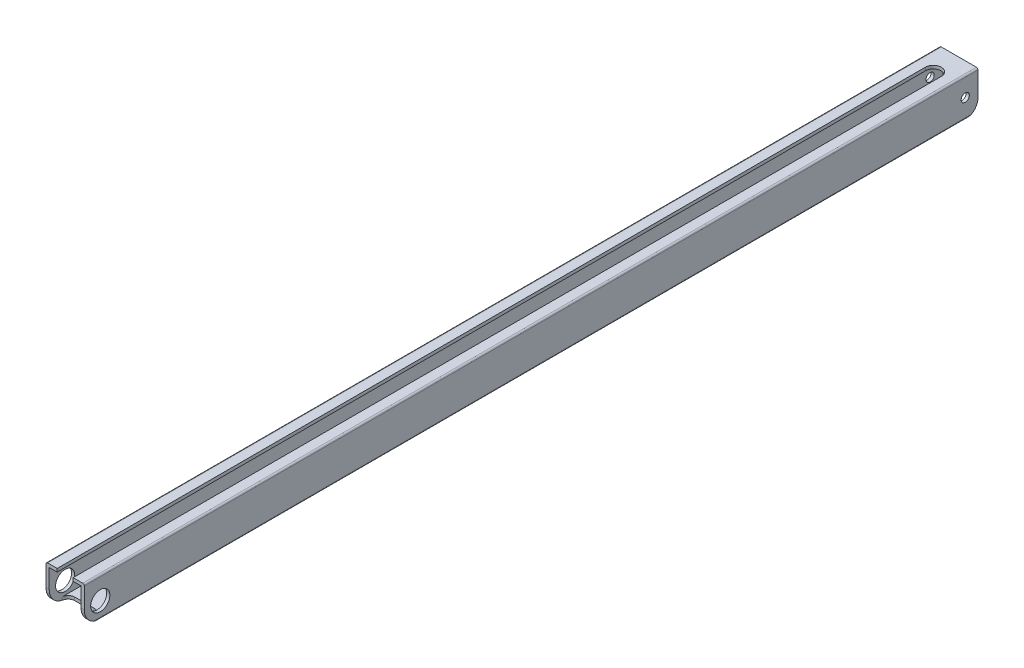
ISO-10303-21;
HEADER;
FILE_DESCRIPTION(('STEP AP214'),'2;1');
FILE_NAME('part.step','',(''),(''),'','','');
FILE_SCHEMA(('AUTOMOTIVE_DESIGN { 1 0 10303 214 1 1 1 1 }'));
ENDSEC;
DATA;
#1=APPLICATION_CONTEXT('core data for automotive mechanical design processes');
#2=APPLICATION_PROTOCOL_DEFINITION('international standard','automotive_design',2000,#1);
#3=PRODUCT_CONTEXT('',#1,'mechanical');
#4=PRODUCT('Part','Part','',(#3));
#5=PRODUCT_RELATED_PRODUCT_CATEGORY('part','',(#4));
#6=PRODUCT_DEFINITION_FORMATION('','',#4);
#7=PRODUCT_DEFINITION_CONTEXT('part definition',#1,'design');
#8=PRODUCT_DEFINITION('design','',#6,#7);
#9=PRODUCT_DEFINITION_SHAPE('','',#8);
#10=(LENGTH_UNIT() NAMED_UNIT(*) SI_UNIT(.MILLI.,.METRE.));
#11=(NAMED_UNIT(*) PLANE_ANGLE_UNIT() SI_UNIT($,.RADIAN.));
#12=(NAMED_UNIT(*) SI_UNIT($,.STERADIAN.) SOLID_ANGLE_UNIT());
#13=UNCERTAINTY_MEASURE_WITH_UNIT(LENGTH_MEASURE(1.E-05),#10,'distance_accuracy_value','');
#14=(GEOMETRIC_REPRESENTATION_CONTEXT(3) GLOBAL_UNCERTAINTY_ASSIGNED_CONTEXT((#13)) GLOBAL_UNIT_ASSIGNED_CONTEXT((#10,
#11,#12)) REPRESENTATION_CONTEXT('',''));
#15=CARTESIAN_POINT('',(0.,0.,0.));
#16=DIRECTION('',(0.,0.,1.));
#17=DIRECTION('',(1.,0.,0.));
#18=AXIS2_PLACEMENT_3D('',#15,#16,#17);
#19=CARTESIAN_POINT('',(0.,0.,-222.25));
#20=DIRECTION('',(0.,0.,-1.));
#21=DIRECTION('',(-1.,0.,0.));
#22=AXIS2_PLACEMENT_3D('',#19,#20,#21);
#23=PLANE('',#22);
#24=DIRECTION('',(0.,1.,0.));
#25=VECTOR('',#24,1.);
#26=CARTESIAN_POINT('',(9.525,-9.525,-222.25));
#27=LINE('',#26,#25);
#28=CARTESIAN_POINT('',(9.525,-3.175,-222.25));
#29=VERTEX_POINT('',#28);
#30=CARTESIAN_POINT('',(9.525,8.73125,-222.25));
#31=VERTEX_POINT('',#30);
#32=EDGE_CURVE('E297',#29,#31,#27,.T.);
#33=ORIENTED_EDGE('',*,*,#32,.F.);
#34=DIRECTION('',(1.,0.,0.));
#35=VECTOR('',#34,1.);
#36=CARTESIAN_POINT('',(-9.525,-3.175,-222.25));
#37=LINE('',#36,#35);
#38=CARTESIAN_POINT('',(7.9375,-3.175,-222.25));
#39=VERTEX_POINT('',#38);
#40=EDGE_CURVE('E280',#39,#29,#37,.T.);
#41=ORIENTED_EDGE('',*,*,#40,.F.);
#42=DIRECTION('',(0.,1.,0.));
#43=VECTOR('',#42,1.);
#44=CARTESIAN_POINT('',(7.9375,-7.9375,-222.25));
#45=LINE('',#44,#43);
#46=CARTESIAN_POINT('',(7.9375,7.9375,-222.25));
#47=VERTEX_POINT('',#46);
#48=EDGE_CURVE('E628',#39,#47,#45,.T.);
#49=ORIENTED_EDGE('',*,*,#48,.T.);
#50=DIRECTION('',(-1.,0.,0.));
#51=VECTOR('',#50,1.);
#52=CARTESIAN_POINT('',(7.9375,7.9375,-222.25));
#53=LINE('',#52,#51);
#54=CARTESIAN_POINT('',(-7.9375,7.9375,-222.25));
#55=VERTEX_POINT('',#54);
#56=EDGE_CURVE('E618',#47,#55,#53,.T.);
#57=ORIENTED_EDGE('',*,*,#56,.T.);
#58=DIRECTION('',(0.,-1.,0.));
#59=VECTOR('',#58,1.);
#60=CARTESIAN_POINT('',(-7.9375,-7.9375,-222.25));
#61=LINE('',#60,#59);
#62=CARTESIAN_POINT('',(-7.9375,-3.175,-222.25));
#63=VERTEX_POINT('',#62);
#64=EDGE_CURVE('E278',#55,#63,#61,.T.);
#65=ORIENTED_EDGE('',*,*,#64,.T.);
#66=CARTESIAN_POINT('',(-9.525,-3.175,-222.25));
#67=VERTEX_POINT('',#66);
#68=EDGE_CURVE('E262',#67,#63,#37,.T.);
#69=ORIENTED_EDGE('',*,*,#68,.F.);
#70=DIRECTION('',(0.,-1.,0.));
#71=VECTOR('',#70,1.);
#72=CARTESIAN_POINT('',(-9.525,-9.525,-222.25));
#73=LINE('',#72,#71);
#74=CARTESIAN_POINT('',(-9.525,8.73125,-222.25));
#75=VERTEX_POINT('',#74);
#76=EDGE_CURVE('E276',#75,#67,#73,.T.);
#77=ORIENTED_EDGE('',*,*,#76,.F.);
#78=CARTESIAN_POINT('',(-8.73125,8.73125,-222.25));
#79=DIRECTION('',(0.,0.,-1.));
#80=DIRECTION('',(-1.,0.,0.));
#81=AXIS2_PLACEMENT_3D('',#78,#79,#80);
#82=CIRCLE('',#81,0.79375);
#83=CARTESIAN_POINT('',(-8.73125,9.525,-222.25));
#84=VERTEX_POINT('',#83);
#85=EDGE_CURVE('E313',#75,#84,#82,.T.);
#86=ORIENTED_EDGE('',*,*,#85,.T.);
#87=DIRECTION('',(-1.,0.,0.));
#88=VECTOR('',#87,1.);
#89=CARTESIAN_POINT('',(-9.525,9.525,-222.25));
#90=LINE('',#89,#88);
#91=CARTESIAN_POINT('',(8.73125,9.525,-222.25));
#92=VERTEX_POINT('',#91);
#93=EDGE_CURVE('E289',#92,#84,#90,.T.);
#94=ORIENTED_EDGE('',*,*,#93,.F.);
#95=CARTESIAN_POINT('',(8.73125,8.73125,-222.25));
#96=DIRECTION('',(0.,0.,-1.));
#97=DIRECTION('',(-1.,0.,0.));
#98=AXIS2_PLACEMENT_3D('',#95,#96,#97);
#99=CIRCLE('',#98,0.79375);
#100=EDGE_CURVE('E309',#92,#31,#99,.T.);
#101=ORIENTED_EDGE('',*,*,#100,.T.);
#102=EDGE_LOOP('',(#33,#41,#49,#57,#65,#69,#77,#86,#94,#101));
#103=FACE_BOUND('',#102,.T.);
#104=ADVANCED_FACE('F45',(#103),#23,.T.);
#105=CARTESIAN_POINT('',(-9.525,-9.525,222.25));
#106=DIRECTION('',(0.,1.,0.));
#107=DIRECTION('',(0.,0.,1.));
#108=AXIS2_PLACEMENT_3D('',#105,#106,#107);
#109=PLANE('',#108);
#110=DIRECTION('',(1.,0.,0.));
#111=VECTOR('',#110,1.);
#112=CARTESIAN_POINT('',(-9.525,-9.525,-215.9));
#113=LINE('',#112,#111);
#114=CARTESIAN_POINT('',(-8.73125,-9.525,-215.9));
#115=VERTEX_POINT('',#114);
#116=CARTESIAN_POINT('',(8.73125,-9.525,-215.9));
#117=VERTEX_POINT('',#116);
#118=EDGE_CURVE('E270',#115,#117,#113,.T.);
#119=ORIENTED_EDGE('',*,*,#118,.T.);
#120=DIRECTION('',(0.,0.,-1.));
#121=VECTOR('',#120,1.);
#122=CARTESIAN_POINT('',(8.73125,-9.525,222.25));
#123=LINE('',#122,#121);
#124=CARTESIAN_POINT('',(8.73125,-9.525,214.3125));
#125=VERTEX_POINT('',#124);
#126=EDGE_CURVE('E301',#117,#125,#123,.F.);
#127=ORIENTED_EDGE('',*,*,#126,.T.);
#128=DIRECTION('',(1.,0.,0.));
#129=VECTOR('',#128,1.);
#130=CARTESIAN_POINT('',(-9.525,-9.525,214.3125));
#131=LINE('',#130,#129);
#132=CARTESIAN_POINT('',(7.5121306570156,-9.525,214.3125));
#133=VERTEX_POINT('',#132);
#134=EDGE_CURVE('E544',#133,#125,#131,.T.);
#135=ORIENTED_EDGE('',*,*,#134,.F.);
#136=CARTESIAN_POINT('',(4.7625,-9.525,215.9));
#137=DIRECTION('',(0.,1.,0.));
#138=DIRECTION('',(0.,0.,1.));
#139=AXIS2_PLACEMENT_3D('',#136,#137,#138);
#140=CIRCLE('',#139,3.175);
#141=CARTESIAN_POINT('',(4.7625,-9.525,212.725));
#142=VERTEX_POINT('',#141);
#143=EDGE_CURVE('E357',#133,#142,#140,.T.);
#144=ORIENTED_EDGE('',*,*,#143,.T.);
#145=DIRECTION('',(1.,0.,0.));
#146=VECTOR('',#145,1.);
#147=CARTESIAN_POINT('',(7.9375,-9.525,212.725));
#148=LINE('',#147,#146);
#149=CARTESIAN_POINT('',(-4.7625,-9.525,212.725));
#150=VERTEX_POINT('',#149);
#151=EDGE_CURVE('E568',#150,#142,#148,.T.);
#152=ORIENTED_EDGE('',*,*,#151,.F.);
#153=CARTESIAN_POINT('',(-4.7625,-9.525,215.9));
#154=DIRECTION('',(0.,1.,0.));
#155=DIRECTION('',(0.,0.,1.));
#156=AXIS2_PLACEMENT_3D('',#153,#154,#155);
#157=CIRCLE('',#156,3.175);
#158=CARTESIAN_POINT('',(-7.5121306570156,-9.525,214.3125));
#159=VERTEX_POINT('',#158);
#160=EDGE_CURVE('E364',#150,#159,#157,.T.);
#161=ORIENTED_EDGE('',*,*,#160,.T.);
#162=CARTESIAN_POINT('',(-8.73125,-9.525,214.3125));
#163=VERTEX_POINT('',#162);
#164=EDGE_CURVE('E548',#163,#159,#131,.T.);
#165=ORIENTED_EDGE('',*,*,#164,.F.);
#166=DIRECTION('',(0.,0.,-1.));
#167=VECTOR('',#166,1.);
#168=CARTESIAN_POINT('',(-8.73125,-9.525,222.25));
#169=LINE('',#168,#167);
#170=EDGE_CURVE('E304',#163,#115,#169,.T.);
#171=ORIENTED_EDGE('',*,*,#170,.T.);
#172=EDGE_LOOP('',(#119,#127,#135,#144,#152,#161,#165,#171));
#173=FACE_BOUND('',#172,.T.);
#174=ADVANCED_FACE('F443',(#173),#109,.F.);
#175=CARTESIAN_POINT('',(0.,0.,222.25));
#176=DIRECTION('',(0.,0.,-1.));
#177=DIRECTION('',(-1.,0.,0.));
#178=AXIS2_PLACEMENT_3D('',#175,#176,#177);
#179=PLANE('',#178);
#180=DIRECTION('',(1.,0.,0.));
#181=VECTOR('',#180,1.);
#182=CARTESIAN_POINT('',(-9.525,-1.5875,222.25));
#183=LINE('',#182,#181);
#184=CARTESIAN_POINT('',(-9.525,-1.5875,222.25));
#185=VERTEX_POINT('',#184);
#186=CARTESIAN_POINT('',(-7.9375,-1.5875,222.25));
#187=VERTEX_POINT('',#186);
#188=EDGE_CURVE('E549',#185,#187,#183,.T.);
#189=ORIENTED_EDGE('',*,*,#188,.T.);
#190=DIRECTION('',(0.,-1.,0.));
#191=VECTOR('',#190,1.);
#192=CARTESIAN_POINT('',(-7.9375,-7.9375,222.25));
#193=LINE('',#192,#191);
#194=CARTESIAN_POINT('',(-7.9375,7.9375,222.25));
#195=VERTEX_POINT('',#194);
#196=EDGE_CURVE('E613',#195,#187,#193,.T.);
#197=ORIENTED_EDGE('',*,*,#196,.F.);
#198=DIRECTION('',(-1.,0.,0.));
#199=VECTOR('',#198,1.);
#200=CARTESIAN_POINT('',(7.9375,7.9375,222.25));
#201=LINE('',#200,#199);
#202=CARTESIAN_POINT('',(-3.96874999999995,7.9375,222.25));
#203=VERTEX_POINT('',#202);
#204=EDGE_CURVE('E621',#203,#195,#201,.T.);
#205=ORIENTED_EDGE('',*,*,#204,.F.);
#206=DIRECTION('',(0.,1.,0.));
#207=VECTOR('',#206,1.);
#208=CARTESIAN_POINT('',(-3.96874999999995,-9.526,222.25));
#209=LINE('',#208,#207);
#210=CARTESIAN_POINT('',(-3.96874999999995,9.525,222.25));
#211=VERTEX_POINT('',#210);
#212=EDGE_CURVE('E604',#203,#211,#209,.T.);
#213=ORIENTED_EDGE('',*,*,#212,.T.);
#214=DIRECTION('',(-1.,0.,0.));
#215=VECTOR('',#214,1.);
#216=CARTESIAN_POINT('',(-9.525,9.525,222.25));
#217=LINE('',#216,#215);
#218=CARTESIAN_POINT('',(-8.73125,9.525,222.25));
#219=VERTEX_POINT('',#218);
#220=EDGE_CURVE('E293',#211,#219,#217,.T.);
#221=ORIENTED_EDGE('',*,*,#220,.T.);
#222=CARTESIAN_POINT('',(-8.73125,8.73125,222.25));
#223=DIRECTION('',(0.,0.,-1.));
#224=DIRECTION('',(-1.,0.,0.));
#225=AXIS2_PLACEMENT_3D('',#222,#223,#224);
#226=CIRCLE('',#225,0.79375);
#227=CARTESIAN_POINT('',(-9.525,8.73125,222.25));
#228=VERTEX_POINT('',#227);
#229=EDGE_CURVE('E324',#219,#228,#226,.F.);
#230=ORIENTED_EDGE('',*,*,#229,.T.);
#231=DIRECTION('',(0.,-1.,0.));
#232=VECTOR('',#231,1.);
#233=CARTESIAN_POINT('',(-9.525,-9.525,222.25));
#234=LINE('',#233,#232);
#235=EDGE_CURVE('E305',#228,#185,#234,.T.);
#236=ORIENTED_EDGE('',*,*,#235,.T.);
#237=EDGE_LOOP('',(#189,#197,#205,#213,#221,#230,#236));
#238=FACE_BOUND('',#237,.T.);
#239=ADVANCED_FACE('F450',(#238),#179,.F.);
#240=CARTESIAN_POINT('',(7.9375,-1.5875,222.25));
#241=VERTEX_POINT('',#240);
#242=CARTESIAN_POINT('',(9.525,-1.5875,222.25));
#243=VERTEX_POINT('',#242);
#244=EDGE_CURVE('E541',#241,#243,#183,.T.);
#245=ORIENTED_EDGE('',*,*,#244,.T.);
#246=DIRECTION('',(0.,1.,0.));
#247=VECTOR('',#246,1.);
#248=CARTESIAN_POINT('',(9.525,-9.525,222.25));
#249=LINE('',#248,#247);
#250=CARTESIAN_POINT('',(9.525,8.73125,222.25));
#251=VERTEX_POINT('',#250);
#252=EDGE_CURVE('E288',#243,#251,#249,.T.);
#253=ORIENTED_EDGE('',*,*,#252,.T.);
#254=CARTESIAN_POINT('',(8.73125,8.73125,222.25));
#255=DIRECTION('',(0.,0.,-1.));
#256=DIRECTION('',(-1.,0.,0.));
#257=AXIS2_PLACEMENT_3D('',#254,#255,#256);
#258=CIRCLE('',#257,0.79375);
#259=CARTESIAN_POINT('',(8.73125,9.525,222.25));
#260=VERTEX_POINT('',#259);
#261=EDGE_CURVE('E321',#251,#260,#258,.F.);
#262=ORIENTED_EDGE('',*,*,#261,.T.);
#263=CARTESIAN_POINT('',(3.96875,9.525,222.25));
#264=VERTEX_POINT('',#263);
#265=EDGE_CURVE('E648',#260,#264,#217,.T.);
#266=ORIENTED_EDGE('',*,*,#265,.T.);
#267=DIRECTION('',(0.,1.,0.));
#268=VECTOR('',#267,1.);
#269=CARTESIAN_POINT('',(3.96875,-9.526,222.25));
#270=LINE('',#269,#268);
#271=CARTESIAN_POINT('',(3.96875,7.9375,222.25));
#272=VERTEX_POINT('',#271);
#273=EDGE_CURVE('E601',#272,#264,#270,.T.);
#274=ORIENTED_EDGE('',*,*,#273,.F.);
#275=CARTESIAN_POINT('',(7.9375,7.9375,222.25));
#276=VERTEX_POINT('',#275);
#277=EDGE_CURVE('E622',#276,#272,#201,.T.);
#278=ORIENTED_EDGE('',*,*,#277,.F.);
#279=DIRECTION('',(0.,1.,0.));
#280=VECTOR('',#279,1.);
#281=CARTESIAN_POINT('',(7.9375,-7.9375,222.25));
#282=LINE('',#281,#280);
#283=EDGE_CURVE('E617',#241,#276,#282,.T.);
#284=ORIENTED_EDGE('',*,*,#283,.F.);
#285=EDGE_LOOP('',(#245,#253,#262,#266,#274,#278,#284));
#286=FACE_BOUND('',#285,.T.);
#287=ADVANCED_FACE('F466',(#286),#179,.F.);
#288=CARTESIAN_POINT('',(9.525,-9.525,222.25));
#289=DIRECTION('',(-1.,0.,0.));
#290=DIRECTION('',(0.,0.,1.));
#291=AXIS2_PLACEMENT_3D('',#288,#289,#290);
#292=PLANE('',#291);
#293=CARTESIAN_POINT('',(9.525,-1.5875,214.3125));
#294=DIRECTION('',(1.,0.,0.));
#295=DIRECTION('',(0.,0.,-1.));
#296=AXIS2_PLACEMENT_3D('',#293,#294,#295);
#297=CIRCLE('',#296,4.76250000000001);
#298=CARTESIAN_POINT('',(9.525,-1.5875,209.55));
#299=VERTEX_POINT('',#298);
#300=EDGE_CURVE('E511',#299,#299,#297,.T.);
#301=ORIENTED_EDGE('',*,*,#300,.F.);
#302=EDGE_LOOP('',(#301));
#303=FACE_BOUND('',#302,.T.);
#304=CARTESIAN_POINT('',(9.525,0.,-215.9));
#305=DIRECTION('',(1.,0.,0.));
#306=DIRECTION('',(0.,0.,-1.));
#307=AXIS2_PLACEMENT_3D('',#304,#305,#306);
#308=CIRCLE('',#307,2.03200000000001);
#309=CARTESIAN_POINT('',(9.525,0.,-217.932));
#310=VERTEX_POINT('',#309);
#311=EDGE_CURVE('E519',#310,#310,#308,.T.);
#312=ORIENTED_EDGE('',*,*,#311,.F.);
#313=EDGE_LOOP('',(#312));
#314=FACE_BOUND('',#313,.T.);
#315=DIRECTION('',(0.,0.,-1.));
#316=VECTOR('',#315,1.);
#317=CARTESIAN_POINT('',(9.525,-8.73125,222.25));
#318=LINE('',#317,#316);
#319=CARTESIAN_POINT('',(9.525,-8.73125,217.772376036435));
#320=VERTEX_POINT('',#319);
#321=CARTESIAN_POINT('',(9.525,-8.73125,-218.974180531052));
#322=VERTEX_POINT('',#321);
#323=EDGE_CURVE('E339',#320,#322,#318,.T.);
#324=ORIENTED_EDGE('',*,*,#323,.T.);
#325=CARTESIAN_POINT('',(9.525,-3.175,-215.9));
#326=DIRECTION('',(-1.,0.,0.));
#327=DIRECTION('',(0.,0.,-1.));
#328=AXIS2_PLACEMENT_3D('',#325,#326,#327);
#329=CIRCLE('',#328,6.35);
#330=EDGE_CURVE('E70',#29,#322,#329,.T.);
#331=ORIENTED_EDGE('',*,*,#330,.F.);
#332=ORIENTED_EDGE('',*,*,#32,.T.);
#333=DIRECTION('',(0.,0.,-1.));
#334=VECTOR('',#333,1.);
#335=CARTESIAN_POINT('',(9.525,8.73125,222.25));
#336=LINE('',#335,#334);
#337=EDGE_CURVE('E335',#31,#251,#336,.F.);
#338=ORIENTED_EDGE('',*,*,#337,.T.);
#339=ORIENTED_EDGE('',*,*,#252,.F.);
#340=CARTESIAN_POINT('',(9.525,-1.5875,214.3125));
#341=DIRECTION('',(-1.,0.,0.));
#342=DIRECTION('',(0.,0.,-1.));
#343=AXIS2_PLACEMENT_3D('',#340,#341,#342);
#344=CIRCLE('',#343,7.93750000000001);
#345=EDGE_CURVE('E536',#320,#243,#344,.T.);
#346=ORIENTED_EDGE('',*,*,#345,.F.);
#347=EDGE_LOOP('',(#324,#331,#332,#338,#339,#346));
#348=FACE_BOUND('',#347,.T.);
#349=ADVANCED_FACE('F463',(#303,#314,#348),#292,.F.);
#350=CARTESIAN_POINT('',(-9.525,9.525,222.25));
#351=DIRECTION('',(0.,-1.,0.));
#352=DIRECTION('',(0.,0.,-1.));
#353=AXIS2_PLACEMENT_3D('',#350,#351,#352);
#354=PLANE('',#353);
#355=ORIENTED_EDGE('',*,*,#220,.F.);
#356=DIRECTION('',(0.,0.,1.));
#357=VECTOR('',#356,1.);
#358=CARTESIAN_POINT('',(-3.96875,9.525,-209.55));
#359=LINE('',#358,#357);
#360=CARTESIAN_POINT('',(-3.96875,9.525,-209.55));
#361=VERTEX_POINT('',#360);
#362=EDGE_CURVE('E589',#361,#211,#359,.T.);
#363=ORIENTED_EDGE('',*,*,#362,.F.);
#364=CARTESIAN_POINT('',(0.,9.525,-209.55));
#365=DIRECTION('',(0.,1.,0.));
#366=DIRECTION('',(0.,0.,-1.));
#367=AXIS2_PLACEMENT_3D('',#364,#365,#366);
#368=CIRCLE('',#367,3.96875);
#369=CARTESIAN_POINT('',(3.96875,9.525,-209.55));
#370=VERTEX_POINT('',#369);
#371=EDGE_CURVE('E585',#370,#361,#368,.T.);
#372=ORIENTED_EDGE('',*,*,#371,.F.);
#373=DIRECTION('',(0.,0.,-1.));
#374=VECTOR('',#373,1.);
#375=CARTESIAN_POINT('',(3.96875,9.525,222.25));
#376=LINE('',#375,#374);
#377=EDGE_CURVE('E592',#264,#370,#376,.T.);
#378=ORIENTED_EDGE('',*,*,#377,.F.);
#379=ORIENTED_EDGE('',*,*,#265,.F.);
#380=DIRECTION('',(0.,0.,-1.));
#381=VECTOR('',#380,1.);
#382=CARTESIAN_POINT('',(8.73125,9.525,222.25));
#383=LINE('',#382,#381);
#384=EDGE_CURVE('E327',#260,#92,#383,.T.);
#385=ORIENTED_EDGE('',*,*,#384,.T.);
#386=ORIENTED_EDGE('',*,*,#93,.T.);
#387=DIRECTION('',(0.,0.,-1.));
#388=VECTOR('',#387,1.);
#389=CARTESIAN_POINT('',(-8.73125,9.525,222.25));
#390=LINE('',#389,#388);
#391=EDGE_CURVE('E331',#84,#219,#390,.F.);
#392=ORIENTED_EDGE('',*,*,#391,.T.);
#393=EDGE_LOOP('',(#355,#363,#372,#378,#379,#385,#386,#392));
#394=FACE_BOUND('',#393,.T.);
#395=ADVANCED_FACE('F459',(#394),#354,.F.);
#396=CARTESIAN_POINT('',(-9.525,-9.525,222.25));
#397=DIRECTION('',(1.,0.,0.));
#398=DIRECTION('',(0.,0.,-1.));
#399=AXIS2_PLACEMENT_3D('',#396,#397,#398);
#400=PLANE('',#399);
#401=CARTESIAN_POINT('',(-9.525,-1.5875,214.3125));
#402=DIRECTION('',(1.,0.,0.));
#403=DIRECTION('',(0.,0.,-1.));
#404=AXIS2_PLACEMENT_3D('',#401,#402,#403);
#405=CIRCLE('',#404,4.76250000000001);
#406=CARTESIAN_POINT('',(-9.525,-1.5875,209.55));
#407=VERTEX_POINT('',#406);
#408=EDGE_CURVE('E509',#407,#407,#405,.T.);
#409=ORIENTED_EDGE('',*,*,#408,.T.);
#410=EDGE_LOOP('',(#409));
#411=FACE_BOUND('',#410,.T.);
#412=CARTESIAN_POINT('',(-9.525,0.,-215.9));
#413=DIRECTION('',(1.,0.,0.));
#414=DIRECTION('',(0.,0.,-1.));
#415=AXIS2_PLACEMENT_3D('',#412,#413,#414);
#416=CIRCLE('',#415,2.03200000000001);
#417=CARTESIAN_POINT('',(-9.525,0.,-217.932));
#418=VERTEX_POINT('',#417);
#419=EDGE_CURVE('E527',#418,#418,#416,.T.);
#420=ORIENTED_EDGE('',*,*,#419,.T.);
#421=EDGE_LOOP('',(#420));
#422=FACE_BOUND('',#421,.T.);
#423=ORIENTED_EDGE('',*,*,#76,.T.);
#424=CARTESIAN_POINT('',(-9.525,-3.175,-215.9));
#425=DIRECTION('',(-1.,0.,0.));
#426=DIRECTION('',(0.,0.,-1.));
#427=AXIS2_PLACEMENT_3D('',#424,#425,#426);
#428=CIRCLE('',#427,6.35);
#429=CARTESIAN_POINT('',(-9.525,-8.73125,-218.974180531052));
#430=VERTEX_POINT('',#429);
#431=EDGE_CURVE('E259',#67,#430,#428,.T.);
#432=ORIENTED_EDGE('',*,*,#431,.T.);
#433=DIRECTION('',(0.,0.,-1.));
#434=VECTOR('',#433,1.);
#435=CARTESIAN_POINT('',(-9.525,-8.73125,222.25));
#436=LINE('',#435,#434);
#437=CARTESIAN_POINT('',(-9.525,-8.73125,217.772376036435));
#438=VERTEX_POINT('',#437);
#439=EDGE_CURVE('E318',#430,#438,#436,.F.);
#440=ORIENTED_EDGE('',*,*,#439,.T.);
#441=CARTESIAN_POINT('',(-9.525,-1.5875,214.3125));
#442=DIRECTION('',(-1.,0.,0.));
#443=DIRECTION('',(0.,0.,-1.));
#444=AXIS2_PLACEMENT_3D('',#441,#442,#443);
#445=CIRCLE('',#444,7.93750000000001);
#446=EDGE_CURVE('E537',#438,#185,#445,.T.);
#447=ORIENTED_EDGE('',*,*,#446,.T.);
#448=ORIENTED_EDGE('',*,*,#235,.F.);
#449=DIRECTION('',(0.,0.,-1.));
#450=VECTOR('',#449,1.);
#451=CARTESIAN_POINT('',(-9.525,8.73125,222.25));
#452=LINE('',#451,#450);
#453=EDGE_CURVE('E286',#228,#75,#452,.T.);
#454=ORIENTED_EDGE('',*,*,#453,.T.);
#455=EDGE_LOOP('',(#423,#432,#440,#447,#448,#454));
#456=FACE_BOUND('',#455,.T.);
#457=ADVANCED_FACE('F283',(#411,#422,#456),#400,.F.);
#458=CARTESIAN_POINT('',(-7.9375,-7.9375,222.25));
#459=DIRECTION('',(1.,0.,0.));
#460=DIRECTION('',(0.,0.,-1.));
#461=AXIS2_PLACEMENT_3D('',#458,#459,#460);
#462=PLANE('',#461);
#463=CARTESIAN_POINT('',(-7.9375,-3.175,-215.9));
#464=DIRECTION('',(1.,0.,0.));
#465=DIRECTION('',(0.,0.,-1.));
#466=AXIS2_PLACEMENT_3D('',#463,#464,#465);
#467=CIRCLE('',#466,6.35);
#468=CARTESIAN_POINT('',(-7.9375,-7.9375,-220.100130206315));
#469=VERTEX_POINT('',#468);
#470=EDGE_CURVE('E522',#63,#469,#467,.F.);
#471=ORIENTED_EDGE('',*,*,#470,.F.);
#472=ORIENTED_EDGE('',*,*,#64,.F.);
#473=DIRECTION('',(0.,0.,-1.));
#474=VECTOR('',#473,1.);
#475=CARTESIAN_POINT('',(-7.9375,7.9375,222.25));
#476=LINE('',#475,#474);
#477=EDGE_CURVE('E626',#195,#55,#476,.T.);
#478=ORIENTED_EDGE('',*,*,#477,.F.);
#479=ORIENTED_EDGE('',*,*,#196,.T.);
#480=CARTESIAN_POINT('',(-7.9375,-1.5875,214.3125));
#481=DIRECTION('',(1.,0.,0.));
#482=DIRECTION('',(0.,0.,-1.));
#483=AXIS2_PLACEMENT_3D('',#480,#481,#482);
#484=CIRCLE('',#483,7.93750000000001);
#485=CARTESIAN_POINT('',(-7.9375,-9.3646299333366,215.9));
#486=VERTEX_POINT('',#485);
#487=EDGE_CURVE('E552',#486,#187,#484,.F.);
#488=ORIENTED_EDGE('',*,*,#487,.F.);
#489=DIRECTION('',(0.,-1.,0.));
#490=VECTOR('',#489,1.);
#491=CARTESIAN_POINT('',(-7.9375,-7.9375,215.9));
#492=LINE('',#491,#490);
#493=CARTESIAN_POINT('',(-7.9375,-7.9375,215.9));
#494=VERTEX_POINT('',#493);
#495=EDGE_CURVE('E354',#486,#494,#492,.F.);
#496=ORIENTED_EDGE('',*,*,#495,.T.);
#497=DIRECTION('',(0.,0.,-1.));
#498=VECTOR('',#497,1.);
#499=CARTESIAN_POINT('',(-7.9375,-7.9375,222.25));
#500=LINE('',#499,#498);
#501=EDGE_CURVE('E644',#494,#469,#500,.T.);
#502=ORIENTED_EDGE('',*,*,#501,.T.);
#503=EDGE_LOOP('',(#471,#472,#478,#479,#488,#496,#502));
#504=FACE_BOUND('',#503,.T.);
#505=CARTESIAN_POINT('',(-7.9375,-1.5875,214.3125));
#506=DIRECTION('',(1.,0.,0.));
#507=DIRECTION('',(0.,0.,-1.));
#508=AXIS2_PLACEMENT_3D('',#505,#506,#507);
#509=CIRCLE('',#508,4.76250000000001);
#510=CARTESIAN_POINT('',(-7.9375,-1.5875,209.55));
#511=VERTEX_POINT('',#510);
#512=EDGE_CURVE('E506',#511,#511,#509,.T.);
#513=ORIENTED_EDGE('',*,*,#512,.F.);
#514=EDGE_LOOP('',(#513));
#515=FACE_BOUND('',#514,.T.);
#516=CARTESIAN_POINT('',(-7.9375,0.,-215.9));
#517=DIRECTION('',(1.,0.,0.));
#518=DIRECTION('',(0.,0.,-1.));
#519=AXIS2_PLACEMENT_3D('',#516,#517,#518);
#520=CIRCLE('',#519,2.03200000000001);
#521=CARTESIAN_POINT('',(-7.9375,0.,-217.932));
#522=VERTEX_POINT('',#521);
#523=EDGE_CURVE('E516',#522,#522,#520,.T.);
#524=ORIENTED_EDGE('',*,*,#523,.F.);
#525=EDGE_LOOP('',(#524));
#526=FACE_BOUND('',#525,.T.);
#527=ADVANCED_FACE('F458',(#504,#515,#526),#462,.T.);
#528=CARTESIAN_POINT('',(7.9375,-7.9375,222.25));
#529=DIRECTION('',(0.,1.,0.));
#530=DIRECTION('',(0.,0.,1.));
#531=AXIS2_PLACEMENT_3D('',#528,#529,#530);
#532=PLANE('',#531);
#533=DIRECTION('',(1.,0.,0.));
#534=VECTOR('',#533,1.);
#535=CARTESIAN_POINT('',(-9.525,-7.9375,-220.100130206315));
#536=LINE('',#535,#534);
#537=CARTESIAN_POINT('',(7.9375,-7.9375,-220.100130206315));
#538=VERTEX_POINT('',#537);
#539=EDGE_CURVE('E693',#469,#538,#536,.T.);
#540=ORIENTED_EDGE('',*,*,#539,.F.);
#541=ORIENTED_EDGE('',*,*,#501,.F.);
#542=CARTESIAN_POINT('',(-4.7625,-7.9375,215.9));
#543=DIRECTION('',(0.,1.,0.));
#544=DIRECTION('',(0.,0.,1.));
#545=AXIS2_PLACEMENT_3D('',#542,#543,#544);
#546=CIRCLE('',#545,3.175);
#547=CARTESIAN_POINT('',(-4.7625,-7.9375,212.725));
#548=VERTEX_POINT('',#547);
#549=EDGE_CURVE('E368',#494,#548,#546,.F.);
#550=ORIENTED_EDGE('',*,*,#549,.T.);
#551=DIRECTION('',(1.,0.,0.));
#552=VECTOR('',#551,1.);
#553=CARTESIAN_POINT('',(7.9375,-7.9375,212.725));
#554=LINE('',#553,#552);
#555=CARTESIAN_POINT('',(4.7625,-7.9375,212.725));
#556=VERTEX_POINT('',#555);
#557=EDGE_CURVE('E573',#548,#556,#554,.T.);
#558=ORIENTED_EDGE('',*,*,#557,.T.);
#559=CARTESIAN_POINT('',(4.7625,-7.9375,215.9));
#560=DIRECTION('',(0.,1.,0.));
#561=DIRECTION('',(0.,0.,1.));
#562=AXIS2_PLACEMENT_3D('',#559,#560,#561);
#563=CIRCLE('',#562,3.175);
#564=CARTESIAN_POINT('',(7.9375,-7.9375,215.9));
#565=VERTEX_POINT('',#564);
#566=EDGE_CURVE('E360',#556,#565,#563,.F.);
#567=ORIENTED_EDGE('',*,*,#566,.T.);
#568=DIRECTION('',(0.,0.,-1.));
#569=VECTOR('',#568,1.);
#570=CARTESIAN_POINT('',(7.9375,-7.9375,222.25));
#571=LINE('',#570,#569);
#572=EDGE_CURVE('E640',#565,#538,#571,.T.);
#573=ORIENTED_EDGE('',*,*,#572,.T.);
#574=EDGE_LOOP('',(#540,#541,#550,#558,#567,#573));
#575=FACE_BOUND('',#574,.T.);
#576=ADVANCED_FACE('F700',(#575),#532,.T.);
#577=CARTESIAN_POINT('',(7.9375,-7.9375,222.25));
#578=DIRECTION('',(-1.,0.,0.));
#579=DIRECTION('',(0.,0.,1.));
#580=AXIS2_PLACEMENT_3D('',#577,#578,#579);
#581=PLANE('',#580);
#582=CARTESIAN_POINT('',(7.9375,-3.175,-215.9));
#583=DIRECTION('',(-1.,0.,0.));
#584=DIRECTION('',(0.,0.,1.));
#585=AXIS2_PLACEMENT_3D('',#582,#583,#584);
#586=CIRCLE('',#585,6.35);
#587=EDGE_CURVE('E482',#538,#39,#586,.F.);
#588=ORIENTED_EDGE('',*,*,#587,.F.);
#589=ORIENTED_EDGE('',*,*,#572,.F.);
#590=DIRECTION('',(0.,-1.,0.));
#591=VECTOR('',#590,1.);
#592=CARTESIAN_POINT('',(7.9375,-7.9375,215.9));
#593=LINE('',#592,#591);
#594=CARTESIAN_POINT('',(7.9375,-9.3646299333366,215.9));
#595=VERTEX_POINT('',#594);
#596=EDGE_CURVE('E343',#565,#595,#593,.T.);
#597=ORIENTED_EDGE('',*,*,#596,.T.);
#598=CARTESIAN_POINT('',(7.9375,-1.5875,214.3125));
#599=DIRECTION('',(-1.,0.,0.));
#600=DIRECTION('',(0.,0.,1.));
#601=AXIS2_PLACEMENT_3D('',#598,#599,#600);
#602=CIRCLE('',#601,7.93750000000001);
#603=EDGE_CURVE('E81',#241,#595,#602,.F.);
#604=ORIENTED_EDGE('',*,*,#603,.F.);
#605=ORIENTED_EDGE('',*,*,#283,.T.);
#606=DIRECTION('',(0.,0.,-1.));
#607=VECTOR('',#606,1.);
#608=CARTESIAN_POINT('',(7.9375,7.9375,222.25));
#609=LINE('',#608,#607);
#610=EDGE_CURVE('E636',#276,#47,#609,.T.);
#611=ORIENTED_EDGE('',*,*,#610,.T.);
#612=ORIENTED_EDGE('',*,*,#48,.F.);
#613=EDGE_LOOP('',(#588,#589,#597,#604,#605,#611,#612));
#614=FACE_BOUND('',#613,.T.);
#615=CARTESIAN_POINT('',(7.9375,-1.5875,214.3125));
#616=DIRECTION('',(-1.,0.,0.));
#617=DIRECTION('',(0.,0.,1.));
#618=AXIS2_PLACEMENT_3D('',#615,#616,#617);
#619=CIRCLE('',#618,4.76250000000001);
#620=CARTESIAN_POINT('',(7.9375,-1.5875,219.075));
#621=VERTEX_POINT('',#620);
#622=EDGE_CURVE('E534',#621,#621,#619,.T.);
#623=ORIENTED_EDGE('',*,*,#622,.F.);
#624=EDGE_LOOP('',(#623));
#625=FACE_BOUND('',#624,.T.);
#626=CARTESIAN_POINT('',(7.9375,0.,-215.9));
#627=DIRECTION('',(-1.,0.,0.));
#628=DIRECTION('',(0.,0.,1.));
#629=AXIS2_PLACEMENT_3D('',#626,#627,#628);
#630=CIRCLE('',#629,2.03200000000001);
#631=CARTESIAN_POINT('',(7.9375,0.,-213.868));
#632=VERTEX_POINT('',#631);
#633=EDGE_CURVE('E379',#632,#632,#630,.T.);
#634=ORIENTED_EDGE('',*,*,#633,.F.);
#635=EDGE_LOOP('',(#634));
#636=FACE_BOUND('',#635,.T.);
#637=ADVANCED_FACE('F682',(#614,#625,#636),#581,.T.);
#638=CARTESIAN_POINT('',(7.9375,7.9375,222.25));
#639=DIRECTION('',(0.,-1.,0.));
#640=DIRECTION('',(0.,0.,-1.));
#641=AXIS2_PLACEMENT_3D('',#638,#639,#640);
#642=PLANE('',#641);
#643=DIRECTION('',(0.,0.,1.));
#644=VECTOR('',#643,1.);
#645=CARTESIAN_POINT('',(-3.96875,7.9375,-209.55));
#646=LINE('',#645,#644);
#647=CARTESIAN_POINT('',(-3.96875,7.9375,-209.55));
#648=VERTEX_POINT('',#647);
#649=EDGE_CURVE('E600',#648,#203,#646,.T.);
#650=ORIENTED_EDGE('',*,*,#649,.T.);
#651=ORIENTED_EDGE('',*,*,#204,.T.);
#652=ORIENTED_EDGE('',*,*,#477,.T.);
#653=ORIENTED_EDGE('',*,*,#56,.F.);
#654=ORIENTED_EDGE('',*,*,#610,.F.);
#655=ORIENTED_EDGE('',*,*,#277,.T.);
#656=DIRECTION('',(0.,0.,-1.));
#657=VECTOR('',#656,1.);
#658=CARTESIAN_POINT('',(3.96875,7.9375,222.25));
#659=LINE('',#658,#657);
#660=CARTESIAN_POINT('',(3.96875,7.9375,-209.55));
#661=VERTEX_POINT('',#660);
#662=EDGE_CURVE('E578',#272,#661,#659,.T.);
#663=ORIENTED_EDGE('',*,*,#662,.T.);
#664=CARTESIAN_POINT('',(0.,7.9375,-209.55));
#665=DIRECTION('',(0.,-1.,0.));
#666=DIRECTION('',(0.,0.,-1.));
#667=AXIS2_PLACEMENT_3D('',#664,#665,#666);
#668=CIRCLE('',#667,3.96875);
#669=EDGE_CURVE('E572',#661,#648,#668,.F.);
#670=ORIENTED_EDGE('',*,*,#669,.T.);
#671=EDGE_LOOP('',(#650,#651,#652,#653,#654,#655,#663,#670));
#672=FACE_BOUND('',#671,.T.);
#673=ADVANCED_FACE('F471',(#672),#642,.T.);
#674=CARTESIAN_POINT('',(-8.73125,-8.73125,222.25));
#675=DIRECTION('',(0.,0.,-1.));
#676=DIRECTION('',(-1.,0.,0.));
#677=AXIS2_PLACEMENT_3D('',#674,#675,#676);
#678=CYLINDRICAL_SURFACE('',#677,0.79375);
#679=CARTESIAN_POINT('',(-9.525,-8.73125,-218.974180531052));
#680=CARTESIAN_POINT('',(-9.52499281790927,-8.75668876854115,-218.928204629464));
#681=CARTESIAN_POINT('',(-9.52377806786288,-8.78154678846239,-218.881927214407));
#682=CARTESIAN_POINT('',(-9.51920427474088,-8.83005657527126,-218.788872533553));
#683=CARTESIAN_POINT('',(-9.51584615969807,-8.85370885943374,-218.742095492699));
#684=CARTESIAN_POINT('',(-9.50298039818914,-8.92271788037389,-218.601322487984));
#685=CARTESIAN_POINT('',(-9.49067883555969,-8.96624234211001,-218.506675570956));
#686=CARTESIAN_POINT('',(-9.46032614654692,-9.048081196373,-218.316625788039));
#687=CARTESIAN_POINT('',(-9.44230133302376,-9.0864183095923,-218.22122829294));
#688=CARTESIAN_POINT('',(-9.40168518613605,-9.15816304559536,-218.029494613955));
#689=CARTESIAN_POINT('',(-9.37909049428028,-9.19156701149367,-217.933157789587));
#690=CARTESIAN_POINT('',(-9.3148268170019,-9.27312934448194,-217.678440058071));
#691=CARTESIAN_POINT('',(-9.27015379282532,-9.31719494178351,-217.519490230736));
#692=CARTESIAN_POINT('',(-9.17444951792159,-9.39255376666463,-217.200546052831));
#693=CARTESIAN_POINT('',(-9.12341561836983,-9.42384164994097,-217.040551293582));
#694=CARTESIAN_POINT('',(-8.96435255290395,-9.4990135283212,-216.55934440698));
#695=CARTESIAN_POINT('',(-8.85034824418082,-9.52422103015593,-216.236861141698));
#696=CARTESIAN_POINT('',(-8.73479156079956,-9.52499406878792,-215.910017114585));
#697=CARTESIAN_POINT('',(-8.73302073850836,-9.52499999415281,-215.905008474395));
#698=CARTESIAN_POINT('',(-8.73125,-9.525,-215.9));
#699=B_SPLINE_CURVE_WITH_KNOTS('',3,(#679,#680,#681,#682,#683,#684,#685,#686,#687,#688,#689,
#690,#691,#692,#693,#694,#695,#696,#697,#698),.UNSPECIFIED.,.F.,.F.,(4,2,2,2,2,2,2,2,2,4),(0.,
0.15758780598893,0.315107425954629,0.629432646882163,0.942333175628517,1.25546450205547,
1.76734931849231,2.27944801300168,3.3034888296377,3.31942621700364),.UNSPECIFIED.);
#700=EDGE_CURVE('E265',#115,#430,#699,.F.);
#701=ORIENTED_EDGE('',*,*,#700,.F.);
#702=ORIENTED_EDGE('',*,*,#170,.F.);
#703=CARTESIAN_POINT('',(-9.525,-8.73125,217.772376036435));
#704=CARTESIAN_POINT('',(-9.52498795148801,-8.75905466185931,217.714969926155));
#705=CARTESIAN_POINT('',(-9.52353969124644,-8.78615781183562,217.657241845317));
#706=CARTESIAN_POINT('',(-9.51811418224393,-8.83891306631601,217.541271417962));
#707=CARTESIAN_POINT('',(-9.51413801558498,-8.8645657865808,217.483029301998));
#708=CARTESIAN_POINT('',(-9.5040094192292,-8.914347417599,217.366225202158));
#709=CARTESIAN_POINT('',(-9.49786124912941,-8.93847920273326,217.307664063681));
#710=CARTESIAN_POINT('',(-9.48365607588507,-8.98526109962209,217.19017890152));
#711=CARTESIAN_POINT('',(-9.47559884001849,-9.0079110303033,217.131254834448));
#712=CARTESIAN_POINT('',(-9.44899880320009,-9.07344202732632,216.954529084285));
#713=CARTESIAN_POINT('',(-9.42797993692109,-9.11411787029334,216.836271872157));
#714=CARTESIAN_POINT('',(-9.38081279504215,-9.18960274772977,216.598867157125));
#715=CARTESIAN_POINT('',(-9.354661239384,-9.22440800400003,216.479719132027));
#716=CARTESIAN_POINT('',(-9.28700804219391,-9.30111301043875,216.192456012028));
#717=CARTESIAN_POINT('',(-9.24357668795121,-9.34018592344336,216.024032629156));
#718=CARTESIAN_POINT('',(-9.15141753766518,-9.40707505390881,215.686467826418));
#719=CARTESIAN_POINT('',(-9.10268895594129,-9.43488959863981,215.517326303622));
#720=CARTESIAN_POINT('',(-8.95149574207137,-9.50175508687381,215.009076047353));
#721=CARTESIAN_POINT('',(-8.84399663506316,-9.52425531368615,214.669037651669));
#722=CARTESIAN_POINT('',(-8.73483159795791,-9.52499393533114,214.323826067074));
#723=CARTESIAN_POINT('',(-8.73304076573607,-9.52499999548801,214.318162961362));
#724=CARTESIAN_POINT('',(-8.73125,-9.525,214.3125));
#725=B_SPLINE_CURVE_WITH_KNOTS('',3,(#703,#704,#705,#706,#707,#708,#709,#710,#711,#712,#713,
#714,#715,#716,#717,#718,#719,#720,#721,#722,#723,#724),.UNSPECIFIED.,.F.,.F.,(4,2,2,2,2,2,2,2,
2,2,4),(0.,0.191312004015116,0.382542169620861,0.573399369680938,0.764279847906662,
1.14440189446982,1.52476765462153,2.0590223347956,2.59335636359023,3.66169414000817,
3.67951267906318),.UNSPECIFIED.);
#726=EDGE_CURVE('E410',#438,#163,#725,.T.);
#727=ORIENTED_EDGE('',*,*,#726,.F.);
#728=ORIENTED_EDGE('',*,*,#439,.F.);
#729=EDGE_LOOP('',(#701,#702,#727,#728));
#730=FACE_BOUND('',#729,.T.);
#731=ADVANCED_FACE('F468',(#730),#678,.T.);
#732=CARTESIAN_POINT('',(-8.73125,8.73125,222.25));
#733=DIRECTION('',(0.,0.,-1.));
#734=DIRECTION('',(-1.,0.,0.));
#735=AXIS2_PLACEMENT_3D('',#732,#733,#734);
#736=CYLINDRICAL_SURFACE('',#735,0.79375);
#737=ORIENTED_EDGE('',*,*,#229,.F.);
#738=ORIENTED_EDGE('',*,*,#391,.F.);
#739=ORIENTED_EDGE('',*,*,#85,.F.);
#740=ORIENTED_EDGE('',*,*,#453,.F.);
#741=EDGE_LOOP('',(#737,#738,#739,#740));
#742=FACE_BOUND('',#741,.T.);
#743=ADVANCED_FACE('F423',(#742),#736,.T.);
#744=CARTESIAN_POINT('',(8.73125,-8.73125,222.25));
#745=DIRECTION('',(0.,0.,-1.));
#746=DIRECTION('',(-1.,0.,0.));
#747=AXIS2_PLACEMENT_3D('',#744,#745,#746);
#748=CYLINDRICAL_SURFACE('',#747,0.79375);
#749=CARTESIAN_POINT('',(9.525,-8.73125,-218.974180531052));
#750=CARTESIAN_POINT('',(9.52499281790927,-8.75668876854115,-218.928204629464));
#751=CARTESIAN_POINT('',(9.52377806786288,-8.78154678846239,-218.881927214407));
#752=CARTESIAN_POINT('',(9.51920427474088,-8.83005657527126,-218.788872533553));
#753=CARTESIAN_POINT('',(9.51584615969807,-8.85370885943374,-218.742095492699));
#754=CARTESIAN_POINT('',(9.50298039818914,-8.92271788037389,-218.601322487984));
#755=CARTESIAN_POINT('',(9.49067883555969,-8.96624234211001,-218.506675570956));
#756=CARTESIAN_POINT('',(9.46032614654692,-9.048081196373,-218.316625788039));
#757=CARTESIAN_POINT('',(9.44230133302376,-9.0864183095923,-218.22122829294));
#758=CARTESIAN_POINT('',(9.40168518613605,-9.15816304559536,-218.029494613955));
#759=CARTESIAN_POINT('',(9.37909049428028,-9.19156701149367,-217.933157789587));
#760=CARTESIAN_POINT('',(9.3148268170019,-9.27312934448194,-217.678440058071));
#761=CARTESIAN_POINT('',(9.27015379282532,-9.31719494178351,-217.519490230736));
#762=CARTESIAN_POINT('',(9.17444951792159,-9.39255376666463,-217.200546052831));
#763=CARTESIAN_POINT('',(9.12341561836983,-9.42384164994097,-217.040551293582));
#764=CARTESIAN_POINT('',(8.96435255290395,-9.4990135283212,-216.55934440698));
#765=CARTESIAN_POINT('',(8.85034824418082,-9.52422103015593,-216.236861141698));
#766=CARTESIAN_POINT('',(8.73479156079956,-9.52499406878792,-215.910017114585));
#767=CARTESIAN_POINT('',(8.73302073850836,-9.52499999415281,-215.905008474395));
#768=CARTESIAN_POINT('',(8.73125,-9.525,-215.9));
#769=B_SPLINE_CURVE_WITH_KNOTS('',3,(#749,#750,#751,#752,#753,#754,#755,#756,#757,#758,#759,
#760,#761,#762,#763,#764,#765,#766,#767,#768),.UNSPECIFIED.,.F.,.F.,(4,2,2,2,2,2,2,2,2,4),(0.,
0.15758780598893,0.315107425954629,0.629432646882163,0.942333175628517,1.25546450205547,
1.76734931849231,2.27944801300168,3.3034888296377,3.31942621700364),.UNSPECIFIED.);
#770=EDGE_CURVE('E11',#322,#117,#769,.T.);
#771=ORIENTED_EDGE('',*,*,#770,.F.);
#772=ORIENTED_EDGE('',*,*,#323,.F.);
#773=CARTESIAN_POINT('',(9.525,-8.73125,217.772376036435));
#774=CARTESIAN_POINT('',(9.52498795148801,-8.75905466185931,217.714969926155));
#775=CARTESIAN_POINT('',(9.52353969124644,-8.78615781183562,217.657241845317));
#776=CARTESIAN_POINT('',(9.51811418224393,-8.83891306631601,217.541271417962));
#777=CARTESIAN_POINT('',(9.51413801558498,-8.8645657865808,217.483029301998));
#778=CARTESIAN_POINT('',(9.5040094192292,-8.914347417599,217.366225202158));
#779=CARTESIAN_POINT('',(9.49786124912941,-8.93847920273326,217.307664063681));
#780=CARTESIAN_POINT('',(9.48365607588507,-8.98526109962209,217.19017890152));
#781=CARTESIAN_POINT('',(9.47559884001849,-9.0079110303033,217.131254834448));
#782=CARTESIAN_POINT('',(9.44899880320009,-9.07344202732632,216.954529084285));
#783=CARTESIAN_POINT('',(9.42797993692109,-9.11411787029334,216.836271872157));
#784=CARTESIAN_POINT('',(9.38081279504215,-9.18960274772977,216.598867157125));
#785=CARTESIAN_POINT('',(9.354661239384,-9.22440800400003,216.479719132027));
#786=CARTESIAN_POINT('',(9.28700804219391,-9.30111301043875,216.192456012028));
#787=CARTESIAN_POINT('',(9.24357668795121,-9.34018592344336,216.024032629156));
#788=CARTESIAN_POINT('',(9.15141753766518,-9.40707505390881,215.686467826418));
#789=CARTESIAN_POINT('',(9.10268895594129,-9.43488959863981,215.517326303622));
#790=CARTESIAN_POINT('',(8.95149574207137,-9.50175508687381,215.009076047353));
#791=CARTESIAN_POINT('',(8.84399663506316,-9.52425531368615,214.669037651669));
#792=CARTESIAN_POINT('',(8.73483159795791,-9.52499393533114,214.323826067074));
#793=CARTESIAN_POINT('',(8.73304076573607,-9.52499999548801,214.318162961362));
#794=CARTESIAN_POINT('',(8.73125,-9.525,214.3125));
#795=B_SPLINE_CURVE_WITH_KNOTS('',3,(#773,#774,#775,#776,#777,#778,#779,#780,#781,#782,#783,
#784,#785,#786,#787,#788,#789,#790,#791,#792,#793,#794),.UNSPECIFIED.,.F.,.F.,(4,2,2,2,2,2,2,2,
2,2,4),(0.,0.191312004015116,0.382542169620861,0.573399369680938,0.764279847906662,
1.14440189446982,1.52476765462153,2.0590223347956,2.59335636359023,3.66169414000817,
3.67951267906318),.UNSPECIFIED.);
#796=EDGE_CURVE('E404',#125,#320,#795,.F.);
#797=ORIENTED_EDGE('',*,*,#796,.F.);
#798=ORIENTED_EDGE('',*,*,#126,.F.);
#799=EDGE_LOOP('',(#771,#772,#797,#798));
#800=FACE_BOUND('',#799,.T.);
#801=ADVANCED_FACE('F417',(#800),#748,.T.);
#802=CARTESIAN_POINT('',(8.73125,8.73125,222.25));
#803=DIRECTION('',(0.,0.,-1.));
#804=DIRECTION('',(-1.,0.,0.));
#805=AXIS2_PLACEMENT_3D('',#802,#803,#804);
#806=CYLINDRICAL_SURFACE('',#805,0.79375);
#807=ORIENTED_EDGE('',*,*,#261,.F.);
#808=ORIENTED_EDGE('',*,*,#337,.F.);
#809=ORIENTED_EDGE('',*,*,#100,.F.);
#810=ORIENTED_EDGE('',*,*,#384,.F.);
#811=EDGE_LOOP('',(#807,#808,#809,#810));
#812=FACE_BOUND('',#811,.T.);
#813=ADVANCED_FACE('F422',(#812),#806,.T.);
#814=CARTESIAN_POINT('',(-3.96875,-9.526,-209.55));
#815=DIRECTION('',(-1.,0.,0.));
#816=DIRECTION('',(0.,0.,1.));
#817=AXIS2_PLACEMENT_3D('',#814,#815,#816);
#818=PLANE('',#817);
#819=DIRECTION('',(0.,1.,0.));
#820=VECTOR('',#819,1.);
#821=CARTESIAN_POINT('',(-3.96875,-9.526,-209.55));
#822=LINE('',#821,#820);
#823=EDGE_CURVE('E596',#648,#361,#822,.T.);
#824=ORIENTED_EDGE('',*,*,#823,.T.);
#825=ORIENTED_EDGE('',*,*,#362,.T.);
#826=ORIENTED_EDGE('',*,*,#212,.F.);
#827=ORIENTED_EDGE('',*,*,#649,.F.);
#828=EDGE_LOOP('',(#824,#825,#826,#827));
#829=FACE_BOUND('',#828,.T.);
#830=ADVANCED_FACE('F427',(#829),#818,.F.);
#831=CARTESIAN_POINT('',(3.96875,-9.526,222.25));
#832=DIRECTION('',(1.,0.,0.));
#833=DIRECTION('',(0.,0.,-1.));
#834=AXIS2_PLACEMENT_3D('',#831,#832,#833);
#835=PLANE('',#834);
#836=ORIENTED_EDGE('',*,*,#273,.T.);
#837=ORIENTED_EDGE('',*,*,#377,.T.);
#838=DIRECTION('',(0.,1.,0.));
#839=VECTOR('',#838,1.);
#840=CARTESIAN_POINT('',(3.96875,-9.526,-209.55));
#841=LINE('',#840,#839);
#842=EDGE_CURVE('E597',#661,#370,#841,.T.);
#843=ORIENTED_EDGE('',*,*,#842,.F.);
#844=ORIENTED_EDGE('',*,*,#662,.F.);
#845=EDGE_LOOP('',(#836,#837,#843,#844));
#846=FACE_BOUND('',#845,.T.);
#847=ADVANCED_FACE('F673',(#846),#835,.F.);
#848=CARTESIAN_POINT('',(0.,-9.526,-209.55));
#849=DIRECTION('',(0.,1.,0.));
#850=DIRECTION('',(0.,0.,1.));
#851=AXIS2_PLACEMENT_3D('',#848,#849,#850);
#852=CYLINDRICAL_SURFACE('',#851,3.96875);
#853=ORIENTED_EDGE('',*,*,#842,.T.);
#854=ORIENTED_EDGE('',*,*,#371,.T.);
#855=ORIENTED_EDGE('',*,*,#823,.F.);
#856=ORIENTED_EDGE('',*,*,#669,.F.);
#857=EDGE_LOOP('',(#853,#854,#855,#856));
#858=FACE_BOUND('',#857,.T.);
#859=ADVANCED_FACE('F439',(#858),#852,.F.);
#860=CARTESIAN_POINT('',(7.9375,9.526,212.725));
#861=DIRECTION('',(0.,0.,-1.));
#862=DIRECTION('',(-1.,0.,0.));
#863=AXIS2_PLACEMENT_3D('',#860,#861,#862);
#864=PLANE('',#863);
#865=ORIENTED_EDGE('',*,*,#151,.T.);
#866=DIRECTION('',(0.,-1.,0.));
#867=VECTOR('',#866,1.);
#868=CARTESIAN_POINT('',(4.7625,9.526,212.725));
#869=LINE('',#868,#867);
#870=EDGE_CURVE('E351',#142,#556,#869,.F.);
#871=ORIENTED_EDGE('',*,*,#870,.T.);
#872=ORIENTED_EDGE('',*,*,#557,.F.);
#873=DIRECTION('',(0.,-1.,0.));
#874=VECTOR('',#873,1.);
#875=CARTESIAN_POINT('',(-4.7625,9.526,212.725));
#876=LINE('',#875,#874);
#877=EDGE_CURVE('E347',#548,#150,#876,.T.);
#878=ORIENTED_EDGE('',*,*,#877,.T.);
#879=EDGE_LOOP('',(#865,#871,#872,#878));
#880=FACE_BOUND('',#879,.T.);
#881=ADVANCED_FACE('F389',(#880),#864,.F.);
#882=CARTESIAN_POINT('',(4.7625,-7.9375,215.9));
#883=DIRECTION('',(0.,-1.,0.));
#884=DIRECTION('',(0.,0.,-1.));
#885=AXIS2_PLACEMENT_3D('',#882,#883,#884);
#886=CYLINDRICAL_SURFACE('',#885,3.175);
#887=ORIENTED_EDGE('',*,*,#143,.F.);
#888=CARTESIAN_POINT('',(7.5121306570156,-9.52500000000001,214.3125));
#889=CARTESIAN_POINT('',(7.55478487765071,-9.52500893857336,214.386355234927));
#890=CARTESIAN_POINT('',(7.59444497685556,-9.52396955638689,214.461944873061));
#891=CARTESIAN_POINT('',(7.66754876023156,-9.5195664745438,214.616033295705));
#892=CARTESIAN_POINT('',(7.70099066171341,-9.51620210963991,214.69453290676));
#893=CARTESIAN_POINT('',(7.76070742880833,-9.50702831153894,214.851998770956));
#894=CARTESIAN_POINT('',(7.78713000200692,-9.50127715189827,214.930912360863));
#895=CARTESIAN_POINT('',(7.83364672613401,-9.48720297505572,215.090322314873));
#896=CARTESIAN_POINT('',(7.85374317051748,-9.47888089208138,215.170818094104));
#897=CARTESIAN_POINT('',(7.89280514243479,-9.45654786558591,215.358160793432));
#898=CARTESIAN_POINT('',(7.90945564623607,-9.44157188976154,215.465383158404));
#899=CARTESIAN_POINT('',(7.93190959075366,-9.40677186247164,215.681903192421));
#900=CARTESIAN_POINT('',(7.93754087832995,-9.38687625479271,215.791207265936));
#901=CARTESIAN_POINT('',(7.9375,-9.3646299333366,215.9));
#902=B_SPLINE_CURVE_WITH_KNOTS('',3,(#888,#889,#890,#891,#892,#893,#894,#895,#896,#897,#898,
#899,#900,#901),.UNSPECIFIED.,.F.,.F.,(4,2,2,2,2,2,4),(0.,0.255794229187909,0.511661679095977,
0.761618864434091,1.01148532643236,1.33941806193056,1.67243442951446),.UNSPECIFIED.);
#903=EDGE_CURVE('E396',#133,#595,#902,.T.);
#904=ORIENTED_EDGE('',*,*,#903,.T.);
#905=ORIENTED_EDGE('',*,*,#596,.F.);
#906=ORIENTED_EDGE('',*,*,#566,.F.);
#907=ORIENTED_EDGE('',*,*,#870,.F.);
#908=EDGE_LOOP('',(#887,#904,#905,#906,#907));
#909=FACE_BOUND('',#908,.T.);
#910=ADVANCED_FACE('F429',(#909),#886,.F.);
#911=CARTESIAN_POINT('',(-4.7625,9.526,215.9));
#912=DIRECTION('',(0.,-1.,0.));
#913=DIRECTION('',(0.,0.,-1.));
#914=AXIS2_PLACEMENT_3D('',#911,#912,#913);
#915=CYLINDRICAL_SURFACE('',#914,3.175);
#916=ORIENTED_EDGE('',*,*,#495,.F.);
#917=CARTESIAN_POINT('',(-7.9375,-9.3646299333366,215.9));
#918=CARTESIAN_POINT('',(-7.93751251474798,-9.38169974077156,215.816439177513));
#919=CARTESIAN_POINT('',(-7.9342014386755,-9.39739939417422,215.732592144005));
#920=CARTESIAN_POINT('',(-7.9208869402327,-9.42602656457866,215.564932876333));
#921=CARTESIAN_POINT('',(-7.91088165459883,-9.43895330844666,215.481120658361));
#922=CARTESIAN_POINT('',(-7.88444228041176,-9.46172732589194,215.316112476834));
#923=CARTESIAN_POINT('',(-7.86816194481553,-9.47163880449874,215.234900784214));
#924=CARTESIAN_POINT('',(-7.82923158328258,-9.48882515398347,215.073771574921));
#925=CARTESIAN_POINT('',(-7.80658384548187,-9.49610096984556,214.993853604239));
#926=CARTESIAN_POINT('',(-7.74695128960244,-9.51000014109115,214.811170750867));
#927=CARTESIAN_POINT('',(-7.70769783960532,-9.51570942798321,214.709068851063));
#928=CARTESIAN_POINT('',(-7.61814682752921,-9.52325459319713,214.507772988148));
#929=CARTESIAN_POINT('',(-7.5676874953335,-9.52502905501463,214.408648638556));
#930=CARTESIAN_POINT('',(-7.5121306570156,-9.52500000000001,214.3125));
#931=B_SPLINE_CURVE_WITH_KNOTS('',3,(#917,#918,#919,#920,#921,#922,#923,#924,#925,#926,#927,
#928,#929,#930),.UNSPECIFIED.,.F.,.F.,(4,2,2,2,2,2,4),(0.,0.255793154649498,0.511657536295984,
0.761614841163773,1.01148243803552,1.33941663212355,1.67243437420632),.UNSPECIFIED.);
#932=EDGE_CURVE('E61',#486,#159,#931,.T.);
#933=ORIENTED_EDGE('',*,*,#932,.T.);
#934=ORIENTED_EDGE('',*,*,#160,.F.);
#935=ORIENTED_EDGE('',*,*,#877,.F.);
#936=ORIENTED_EDGE('',*,*,#549,.F.);
#937=EDGE_LOOP('',(#916,#933,#934,#935,#936));
#938=FACE_BOUND('',#937,.T.);
#939=ADVANCED_FACE('F47',(#938),#915,.F.);
#940=CARTESIAN_POINT('',(-9.525,-1.5875,214.3125));
#941=DIRECTION('',(1.,0.,0.));
#942=DIRECTION('',(0.,0.,-1.));
#943=AXIS2_PLACEMENT_3D('',#940,#941,#942);
#944=CYLINDRICAL_SURFACE('',#943,7.93750000000001);
#945=ORIENTED_EDGE('',*,*,#726,.T.);
#946=ORIENTED_EDGE('',*,*,#164,.T.);
#947=ORIENTED_EDGE('',*,*,#932,.F.);
#948=ORIENTED_EDGE('',*,*,#487,.T.);
#949=ORIENTED_EDGE('',*,*,#188,.F.);
#950=ORIENTED_EDGE('',*,*,#446,.F.);
#951=EDGE_LOOP('',(#945,#946,#947,#948,#949,#950));
#952=FACE_BOUND('',#951,.T.);
#953=ADVANCED_FACE('F380',(#952),#944,.T.);
#954=ORIENTED_EDGE('',*,*,#796,.T.);
#955=ORIENTED_EDGE('',*,*,#345,.T.);
#956=ORIENTED_EDGE('',*,*,#244,.F.);
#957=ORIENTED_EDGE('',*,*,#603,.T.);
#958=ORIENTED_EDGE('',*,*,#903,.F.);
#959=ORIENTED_EDGE('',*,*,#134,.T.);
#960=EDGE_LOOP('',(#954,#955,#956,#957,#958,#959));
#961=FACE_BOUND('',#960,.T.);
#962=ADVANCED_FACE('F385',(#961),#944,.T.);
#963=CARTESIAN_POINT('',(-9.525,0.,-215.9));
#964=DIRECTION('',(1.,0.,0.));
#965=DIRECTION('',(0.,0.,-1.));
#966=AXIS2_PLACEMENT_3D('',#963,#964,#965);
#967=CYLINDRICAL_SURFACE('',#966,2.03200000000001);
#968=ORIENTED_EDGE('',*,*,#633,.T.);
#969=EDGE_LOOP('',(#968));
#970=FACE_BOUND('',#969,.T.);
#971=ORIENTED_EDGE('',*,*,#311,.T.);
#972=EDGE_LOOP('',(#971));
#973=FACE_BOUND('',#972,.T.);
#974=ADVANCED_FACE('F387',(#970,#973),#967,.F.);
#975=CARTESIAN_POINT('',(-9.525,-1.5875,214.3125));
#976=DIRECTION('',(1.,0.,0.));
#977=DIRECTION('',(0.,0.,-1.));
#978=AXIS2_PLACEMENT_3D('',#975,#976,#977);
#979=CYLINDRICAL_SURFACE('',#978,4.76250000000001);
#980=ORIENTED_EDGE('',*,*,#622,.T.);
#981=EDGE_LOOP('',(#980));
#982=FACE_BOUND('',#981,.T.);
#983=ORIENTED_EDGE('',*,*,#300,.T.);
#984=EDGE_LOOP('',(#983));
#985=FACE_BOUND('',#984,.T.);
#986=ADVANCED_FACE('F487',(#982,#985),#979,.F.);
#987=ORIENTED_EDGE('',*,*,#523,.T.);
#988=EDGE_LOOP('',(#987));
#989=FACE_BOUND('',#988,.T.);
#990=ORIENTED_EDGE('',*,*,#419,.F.);
#991=EDGE_LOOP('',(#990));
#992=FACE_BOUND('',#991,.T.);
#993=ADVANCED_FACE('F490',(#989,#992),#967,.F.);
#994=ORIENTED_EDGE('',*,*,#512,.T.);
#995=EDGE_LOOP('',(#994));
#996=FACE_BOUND('',#995,.T.);
#997=ORIENTED_EDGE('',*,*,#408,.F.);
#998=EDGE_LOOP('',(#997));
#999=FACE_BOUND('',#998,.T.);
#1000=ADVANCED_FACE('F486',(#996,#999),#979,.F.);
#1001=CARTESIAN_POINT('',(-9.525,-3.175,-215.9));
#1002=DIRECTION('',(1.,0.,0.));
#1003=DIRECTION('',(0.,0.,-1.));
#1004=AXIS2_PLACEMENT_3D('',#1001,#1002,#1003);
#1005=CYLINDRICAL_SURFACE('',#1004,6.35);
#1006=ORIENTED_EDGE('',*,*,#470,.T.);
#1007=ORIENTED_EDGE('',*,*,#539,.T.);
#1008=ORIENTED_EDGE('',*,*,#587,.T.);
#1009=ORIENTED_EDGE('',*,*,#40,.T.);
#1010=ORIENTED_EDGE('',*,*,#330,.T.);
#1011=ORIENTED_EDGE('',*,*,#770,.T.);
#1012=ORIENTED_EDGE('',*,*,#118,.F.);
#1013=ORIENTED_EDGE('',*,*,#700,.T.);
#1014=ORIENTED_EDGE('',*,*,#431,.F.);
#1015=ORIENTED_EDGE('',*,*,#68,.T.);
#1016=EDGE_LOOP('',(#1006,#1007,#1008,#1009,#1010,#1011,#1012,#1013,#1014,#1015));
#1017=FACE_BOUND('',#1016,.T.);
#1018=ADVANCED_FACE('F261',(#1017),#1005,.T.);
#1019=CLOSED_SHELL('',(#104,#174,#239,#287,#349,#395,#457,#527,#576,#637,#673,#731,#743,#801,
#813,#830,#847,#859,#881,#910,#939,#953,#962,#974,#986,#993,#1000,#1018));
#1020=MANIFOLD_SOLID_BREP('B2',#1019);
#1021=ADVANCED_BREP_SHAPE_REPRESENTATION('',(#18,#1020),#14);
#1022=SHAPE_DEFINITION_REPRESENTATION(#9,#1021);
ENDSEC;
END-ISO-10303-21;
